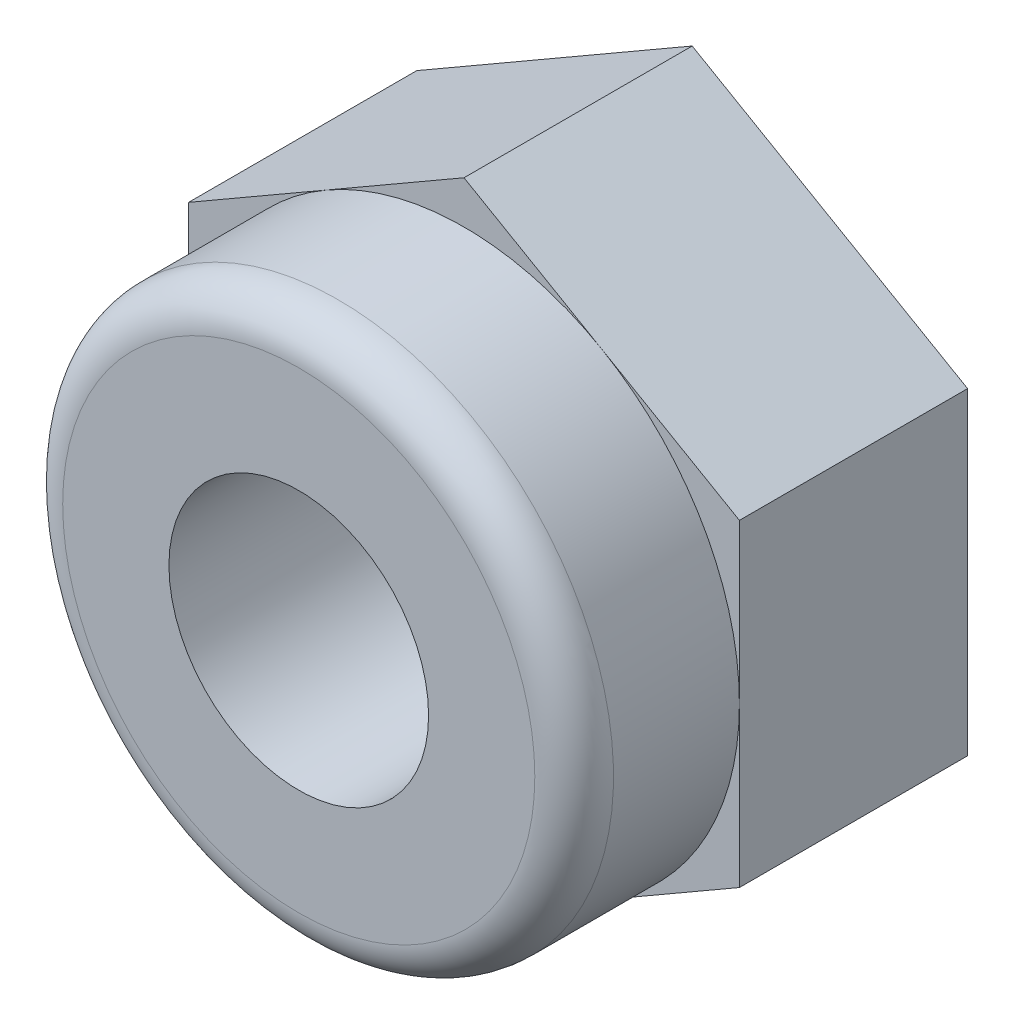
ISO-10303-21;
HEADER;
FILE_DESCRIPTION(('STEP AP214'),'2;1');
FILE_NAME('part.step','',(''),(''),'','','');
FILE_SCHEMA(('AUTOMOTIVE_DESIGN { 1 0 10303 214 1 1 1 1 }'));
ENDSEC;
DATA;
#1=APPLICATION_CONTEXT('core data for automotive mechanical design processes');
#2=APPLICATION_PROTOCOL_DEFINITION('international standard','automotive_design',2000,#1);
#3=PRODUCT_CONTEXT('',#1,'mechanical');
#4=PRODUCT('Part','Part','',(#3));
#5=PRODUCT_RELATED_PRODUCT_CATEGORY('part','',(#4));
#6=PRODUCT_DEFINITION_FORMATION('','',#4);
#7=PRODUCT_DEFINITION_CONTEXT('part definition',#1,'design');
#8=PRODUCT_DEFINITION('design','',#6,#7);
#9=PRODUCT_DEFINITION_SHAPE('','',#8);
#10=(LENGTH_UNIT() NAMED_UNIT(*) SI_UNIT(.MILLI.,.METRE.));
#11=(NAMED_UNIT(*) PLANE_ANGLE_UNIT() SI_UNIT($,.RADIAN.));
#12=(NAMED_UNIT(*) SI_UNIT($,.STERADIAN.) SOLID_ANGLE_UNIT());
#13=UNCERTAINTY_MEASURE_WITH_UNIT(LENGTH_MEASURE(1.E-05),#10,'distance_accuracy_value','');
#14=(GEOMETRIC_REPRESENTATION_CONTEXT(3) GLOBAL_UNCERTAINTY_ASSIGNED_CONTEXT((#13)) GLOBAL_UNIT_ASSIGNED_CONTEXT((#10,
#11,#12)) REPRESENTATION_CONTEXT('',''));
#15=CARTESIAN_POINT('',(0.,0.,0.));
#16=DIRECTION('',(0.,0.,1.));
#17=DIRECTION('',(1.,0.,0.));
#18=AXIS2_PLACEMENT_3D('',#15,#16,#17);
#19=CARTESIAN_POINT('',(0.,0.,4.5));
#20=DIRECTION('',(0.,0.,1.));
#21=DIRECTION('',(1.,0.,0.));
#22=AXIS2_PLACEMENT_3D('',#19,#20,#21);
#23=TOROIDAL_SURFACE('',#22,2.99999999999999,0.5);
#24=CARTESIAN_POINT('',(0.,0.,4.5));
#25=DIRECTION('',(0.,0.,-1.));
#26=DIRECTION('',(-1.,0.,0.));
#27=AXIS2_PLACEMENT_3D('',#24,#25,#26);
#28=CIRCLE('',#27,3.49999999999999);
#29=CARTESIAN_POINT('',(-3.49999999999999,0.,4.5));
#30=VERTEX_POINT('',#29);
#31=EDGE_CURVE('E186',#30,#30,#28,.T.);
#32=ORIENTED_EDGE('',*,*,#31,.F.);
#33=EDGE_LOOP('',(#32));
#34=FACE_BOUND('',#33,.T.);
#35=CARTESIAN_POINT('',(0.,0.,5.));
#36=DIRECTION('',(0.,0.,-1.));
#37=DIRECTION('',(1.,0.,0.));
#38=AXIS2_PLACEMENT_3D('',#35,#36,#37);
#39=CIRCLE('',#38,2.99999999999999);
#40=CARTESIAN_POINT('',(-2.99999999999999,0.,5.));
#41=VERTEX_POINT('',#40);
#42=CARTESIAN_POINT('',(2.99999999999999,0.,5.));
#43=VERTEX_POINT('',#42);
#44=EDGE_CURVE('E116',#41,#43,#39,.F.);
#45=ORIENTED_EDGE('',*,*,#44,.F.);
#46=CARTESIAN_POINT('',(0.,0.,5.));
#47=DIRECTION('',(0.,0.,-1.));
#48=DIRECTION('',(-1.,0.,0.));
#49=AXIS2_PLACEMENT_3D('',#46,#47,#48);
#50=CIRCLE('',#49,2.99999999999999);
#51=EDGE_CURVE('E154',#43,#41,#50,.F.);
#52=ORIENTED_EDGE('',*,*,#51,.F.);
#53=EDGE_LOOP('',(#45,#52));
#54=FACE_BOUND('',#53,.T.);
#55=ADVANCED_FACE('F17',(#34,#54),#23,.T.);
#56=CARTESIAN_POINT('',(0.,0.,5.));
#57=DIRECTION('',(0.,0.,-1.));
#58=DIRECTION('',(-1.,0.,0.));
#59=AXIS2_PLACEMENT_3D('',#56,#57,#58);
#60=CYLINDRICAL_SURFACE('',#59,3.49999999999999);
#61=CARTESIAN_POINT('',(0.,0.,2.9));
#62=DIRECTION('',(0.,0.,-1.));
#63=DIRECTION('',(-1.,0.,0.));
#64=AXIS2_PLACEMENT_3D('',#61,#62,#63);
#65=CIRCLE('',#64,3.49999999999999);
#66=CARTESIAN_POINT('',(3.49999999999999,0.,2.9));
#67=VERTEX_POINT('',#66);
#68=CARTESIAN_POINT('',(1.75000000000002,-3.03108891324551,2.9));
#69=VERTEX_POINT('',#68);
#70=EDGE_CURVE('E203',#67,#69,#65,.T.);
#71=ORIENTED_EDGE('',*,*,#70,.F.);
#72=CARTESIAN_POINT('',(0.,0.,2.9));
#73=DIRECTION('',(0.,0.,-1.));
#74=DIRECTION('',(-1.,0.,0.));
#75=AXIS2_PLACEMENT_3D('',#72,#73,#74);
#76=CIRCLE('',#75,3.49999999999999);
#77=CARTESIAN_POINT('',(1.74999999999998,3.03108891324554,2.9));
#78=VERTEX_POINT('',#77);
#79=EDGE_CURVE('E201',#78,#67,#76,.T.);
#80=ORIENTED_EDGE('',*,*,#79,.F.);
#81=CARTESIAN_POINT('',(0.,0.,2.9));
#82=DIRECTION('',(0.,0.,-1.));
#83=DIRECTION('',(-1.,0.,0.));
#84=AXIS2_PLACEMENT_3D('',#81,#82,#83);
#85=CIRCLE('',#84,3.49999999999999);
#86=CARTESIAN_POINT('',(-1.75,3.03108891324553,2.9));
#87=VERTEX_POINT('',#86);
#88=EDGE_CURVE('E112',#87,#78,#85,.T.);
#89=ORIENTED_EDGE('',*,*,#88,.F.);
#90=CARTESIAN_POINT('',(0.,0.,2.9));
#91=DIRECTION('',(0.,0.,-1.));
#92=DIRECTION('',(-1.,0.,0.));
#93=AXIS2_PLACEMENT_3D('',#90,#91,#92);
#94=CIRCLE('',#93,3.49999999999999);
#95=CARTESIAN_POINT('',(-3.49999999999999,0.,2.9));
#96=VERTEX_POINT('',#95);
#97=EDGE_CURVE('E104',#96,#87,#94,.T.);
#98=ORIENTED_EDGE('',*,*,#97,.F.);
#99=CARTESIAN_POINT('',(0.,0.,2.9));
#100=DIRECTION('',(0.,0.,-1.));
#101=DIRECTION('',(-1.,0.,0.));
#102=AXIS2_PLACEMENT_3D('',#99,#100,#101);
#103=CIRCLE('',#102,3.49999999999999);
#104=CARTESIAN_POINT('',(-1.74999999999998,-3.03108891324554,2.9));
#105=VERTEX_POINT('',#104);
#106=EDGE_CURVE('E93',#105,#96,#103,.T.);
#107=ORIENTED_EDGE('',*,*,#106,.F.);
#108=CARTESIAN_POINT('',(0.,0.,2.9));
#109=DIRECTION('',(0.,0.,-1.));
#110=DIRECTION('',(-1.,0.,0.));
#111=AXIS2_PLACEMENT_3D('',#108,#109,#110);
#112=CIRCLE('',#111,3.49999999999999);
#113=EDGE_CURVE('E103',#69,#105,#112,.T.);
#114=ORIENTED_EDGE('',*,*,#113,.F.);
#115=EDGE_LOOP('',(#71,#80,#89,#98,#107,#114));
#116=FACE_BOUND('',#115,.T.);
#117=ORIENTED_EDGE('',*,*,#31,.T.);
#118=EDGE_LOOP('',(#117));
#119=FACE_BOUND('',#118,.T.);
#120=ADVANCED_FACE('F109',(#116,#119),#60,.T.);
#121=CARTESIAN_POINT('',(0.,0.,5.));
#122=DIRECTION('',(0.,0.,1.));
#123=DIRECTION('',(1.,0.,0.));
#124=AXIS2_PLACEMENT_3D('',#121,#122,#123);
#125=PLANE('',#124);
#126=ORIENTED_EDGE('',*,*,#51,.T.);
#127=ORIENTED_EDGE('',*,*,#44,.T.);
#128=EDGE_LOOP('',(#126,#127));
#129=FACE_BOUND('',#128,.T.);
#130=CARTESIAN_POINT('',(0.,0.,5.));
#131=DIRECTION('',(0.,0.,1.));
#132=DIRECTION('',(1.,0.,0.));
#133=AXIS2_PLACEMENT_3D('',#130,#131,#132);
#134=CIRCLE('',#133,1.65);
#135=CARTESIAN_POINT('',(1.65,0.,5.));
#136=VERTEX_POINT('',#135);
#137=EDGE_CURVE('E197',#136,#136,#134,.F.);
#138=ORIENTED_EDGE('',*,*,#137,.T.);
#139=EDGE_LOOP('',(#138));
#140=FACE_BOUND('',#139,.T.);
#141=ADVANCED_FACE('F161',(#129,#140),#125,.T.);
#142=CARTESIAN_POINT('',(0.,0.,2.9));
#143=DIRECTION('',(0.,0.,1.));
#144=DIRECTION('',(1.,0.,0.));
#145=AXIS2_PLACEMENT_3D('',#142,#143,#144);
#146=PLANE('',#145);
#147=DIRECTION('',(0.866025403784438,0.500000000000001,0.));
#148=VECTOR('',#147,1.);
#149=CARTESIAN_POINT('',(0.,4.04145188432737,2.9));
#150=LINE('',#149,#148);
#151=CARTESIAN_POINT('',(-3.5,2.02072594216368,2.9));
#152=VERTEX_POINT('',#151);
#153=EDGE_CURVE('E128',#87,#152,#150,.F.);
#154=ORIENTED_EDGE('',*,*,#153,.T.);
#155=DIRECTION('',(0.,1.,0.));
#156=VECTOR('',#155,1.);
#157=CARTESIAN_POINT('',(-3.5,2.02072594216368,2.9));
#158=LINE('',#157,#156);
#159=EDGE_CURVE('E122',#152,#96,#158,.F.);
#160=ORIENTED_EDGE('',*,*,#159,.T.);
#161=ORIENTED_EDGE('',*,*,#97,.T.);
#162=EDGE_LOOP('',(#154,#160,#161));
#163=FACE_BOUND('',#162,.T.);
#164=ADVANCED_FACE('F127',(#163),#146,.T.);
#165=CARTESIAN_POINT('',(0.,0.,2.9));
#166=DIRECTION('',(0.,0.,1.));
#167=DIRECTION('',(1.,0.,0.));
#168=AXIS2_PLACEMENT_3D('',#165,#166,#167);
#169=PLANE('',#168);
#170=DIRECTION('',(0.,1.,0.));
#171=VECTOR('',#170,1.);
#172=CARTESIAN_POINT('',(-3.5,2.02072594216368,2.9));
#173=LINE('',#172,#171);
#174=CARTESIAN_POINT('',(-3.49999999999998,-2.0207259421637,2.9));
#175=VERTEX_POINT('',#174);
#176=EDGE_CURVE('E97',#96,#175,#173,.F.);
#177=ORIENTED_EDGE('',*,*,#176,.T.);
#178=DIRECTION('',(-0.866025403784442,0.499999999999995,0.));
#179=VECTOR('',#178,1.);
#180=CARTESIAN_POINT('',(-3.49999999999998,-2.0207259421637,2.9));
#181=LINE('',#180,#179);
#182=EDGE_CURVE('E99',#175,#105,#181,.F.);
#183=ORIENTED_EDGE('',*,*,#182,.T.);
#184=ORIENTED_EDGE('',*,*,#106,.T.);
#185=EDGE_LOOP('',(#177,#183,#184));
#186=FACE_BOUND('',#185,.T.);
#187=ADVANCED_FACE('F95',(#186),#169,.T.);
#188=CARTESIAN_POINT('',(0.,0.,2.9));
#189=DIRECTION('',(0.,0.,1.));
#190=DIRECTION('',(1.,0.,0.));
#191=AXIS2_PLACEMENT_3D('',#188,#189,#190);
#192=PLANE('',#191);
#193=DIRECTION('',(-0.866025403784442,0.499999999999995,0.));
#194=VECTOR('',#193,1.);
#195=CARTESIAN_POINT('',(-3.49999999999998,-2.0207259421637,2.9));
#196=LINE('',#195,#194);
#197=CARTESIAN_POINT('',(0.,-4.04145188432737,2.9));
#198=VERTEX_POINT('',#197);
#199=EDGE_CURVE('E377',#105,#198,#196,.F.);
#200=ORIENTED_EDGE('',*,*,#199,.T.);
#201=DIRECTION('',(-0.866025403784435,-0.500000000000007,0.));
#202=VECTOR('',#201,1.);
#203=CARTESIAN_POINT('',(0.,-4.04145188432737,2.9));
#204=LINE('',#203,#202);
#205=EDGE_CURVE('E379',#198,#69,#204,.F.);
#206=ORIENTED_EDGE('',*,*,#205,.T.);
#207=ORIENTED_EDGE('',*,*,#113,.T.);
#208=EDGE_LOOP('',(#200,#206,#207));
#209=FACE_BOUND('',#208,.T.);
#210=ADVANCED_FACE('F322',(#209),#192,.T.);
#211=CARTESIAN_POINT('',(0.,0.,2.9));
#212=DIRECTION('',(0.,0.,1.));
#213=DIRECTION('',(1.,0.,0.));
#214=AXIS2_PLACEMENT_3D('',#211,#212,#213);
#215=PLANE('',#214);
#216=DIRECTION('',(-0.866025403784435,-0.500000000000007,0.));
#217=VECTOR('',#216,1.);
#218=CARTESIAN_POINT('',(0.,-4.04145188432737,2.9));
#219=LINE('',#218,#217);
#220=CARTESIAN_POINT('',(3.50000000000001,-2.02072594216365,2.9));
#221=VERTEX_POINT('',#220);
#222=EDGE_CURVE('E387',#69,#221,#219,.F.);
#223=ORIENTED_EDGE('',*,*,#222,.T.);
#224=DIRECTION('',(0.,-1.,0.));
#225=VECTOR('',#224,1.);
#226=CARTESIAN_POINT('',(3.50000000000001,-2.02072594216365,2.9));
#227=LINE('',#226,#225);
#228=EDGE_CURVE('E431',#221,#67,#227,.F.);
#229=ORIENTED_EDGE('',*,*,#228,.T.);
#230=ORIENTED_EDGE('',*,*,#70,.T.);
#231=EDGE_LOOP('',(#223,#229,#230));
#232=FACE_BOUND('',#231,.T.);
#233=ADVANCED_FACE('F313',(#232),#215,.T.);
#234=CARTESIAN_POINT('',(0.,0.,2.9));
#235=DIRECTION('',(0.,0.,1.));
#236=DIRECTION('',(1.,0.,0.));
#237=AXIS2_PLACEMENT_3D('',#234,#235,#236);
#238=PLANE('',#237);
#239=DIRECTION('',(0.,-1.,0.));
#240=VECTOR('',#239,1.);
#241=CARTESIAN_POINT('',(3.50000000000001,-2.02072594216365,2.9));
#242=LINE('',#241,#240);
#243=CARTESIAN_POINT('',(3.49999999999997,2.02072594216373,2.9));
#244=VERTEX_POINT('',#243);
#245=EDGE_CURVE('E434',#67,#244,#242,.F.);
#246=ORIENTED_EDGE('',*,*,#245,.T.);
#247=DIRECTION('',(0.866025403784442,-0.499999999999995,0.));
#248=VECTOR('',#247,1.);
#249=CARTESIAN_POINT('',(3.49999999999997,2.02072594216373,2.9));
#250=LINE('',#249,#248);
#251=EDGE_CURVE('E446',#244,#78,#250,.F.);
#252=ORIENTED_EDGE('',*,*,#251,.T.);
#253=ORIENTED_EDGE('',*,*,#79,.T.);
#254=EDGE_LOOP('',(#246,#252,#253));
#255=FACE_BOUND('',#254,.T.);
#256=ADVANCED_FACE('F221',(#255),#238,.T.);
#257=CARTESIAN_POINT('',(0.,0.,2.9));
#258=DIRECTION('',(0.,0.,1.));
#259=DIRECTION('',(1.,0.,0.));
#260=AXIS2_PLACEMENT_3D('',#257,#258,#259);
#261=PLANE('',#260);
#262=DIRECTION('',(0.866025403784442,-0.499999999999995,0.));
#263=VECTOR('',#262,1.);
#264=CARTESIAN_POINT('',(3.49999999999997,2.02072594216373,2.9));
#265=LINE('',#264,#263);
#266=CARTESIAN_POINT('',(0.,4.04145188432737,2.9));
#267=VERTEX_POINT('',#266);
#268=EDGE_CURVE('E418',#78,#267,#265,.F.);
#269=ORIENTED_EDGE('',*,*,#268,.T.);
#270=DIRECTION('',(0.866025403784438,0.500000000000001,0.));
#271=VECTOR('',#270,1.);
#272=CARTESIAN_POINT('',(0.,4.04145188432737,2.9));
#273=LINE('',#272,#271);
#274=EDGE_CURVE('E141',#267,#87,#273,.F.);
#275=ORIENTED_EDGE('',*,*,#274,.T.);
#276=ORIENTED_EDGE('',*,*,#88,.T.);
#277=EDGE_LOOP('',(#269,#275,#276));
#278=FACE_BOUND('',#277,.T.);
#279=ADVANCED_FACE('F211',(#278),#261,.T.);
#280=CARTESIAN_POINT('',(0.,0.,5.));
#281=DIRECTION('',(0.,0.,1.));
#282=DIRECTION('',(1.,0.,0.));
#283=AXIS2_PLACEMENT_3D('',#280,#281,#282);
#284=CYLINDRICAL_SURFACE('',#283,1.65);
#285=CARTESIAN_POINT('',(0.,0.,0.));
#286=DIRECTION('',(0.,0.,1.));
#287=DIRECTION('',(1.,0.,0.));
#288=AXIS2_PLACEMENT_3D('',#285,#286,#287);
#289=CIRCLE('',#288,1.65);
#290=CARTESIAN_POINT('',(1.65,0.,0.));
#291=VERTEX_POINT('',#290);
#292=EDGE_CURVE('E148',#291,#291,#289,.F.);
#293=ORIENTED_EDGE('',*,*,#292,.T.);
#294=EDGE_LOOP('',(#293));
#295=FACE_BOUND('',#294,.T.);
#296=ORIENTED_EDGE('',*,*,#137,.F.);
#297=EDGE_LOOP('',(#296));
#298=FACE_BOUND('',#297,.T.);
#299=ADVANCED_FACE('F208',(#295,#298),#284,.F.);
#300=CARTESIAN_POINT('',(0.,4.04145188432737,2.9));
#301=DIRECTION('',(0.500000000000001,-0.866025403784438,0.));
#302=DIRECTION('',(0.866025403784438,0.500000000000001,0.));
#303=AXIS2_PLACEMENT_3D('',#300,#301,#302);
#304=PLANE('',#303);
#305=DIRECTION('',(0.,0.,1.));
#306=VECTOR('',#305,1.);
#307=CARTESIAN_POINT('',(-3.5,2.02072594216368,2.9));
#308=LINE('',#307,#306);
#309=CARTESIAN_POINT('',(-3.5,2.02072594216368,0.));
#310=VERTEX_POINT('',#309);
#311=EDGE_CURVE('E129',#310,#152,#308,.T.);
#312=ORIENTED_EDGE('',*,*,#311,.T.);
#313=ORIENTED_EDGE('',*,*,#153,.F.);
#314=ORIENTED_EDGE('',*,*,#274,.F.);
#315=DIRECTION('',(0.,0.,1.));
#316=VECTOR('',#315,1.);
#317=CARTESIAN_POINT('',(0.,4.04145188432737,2.9));
#318=LINE('',#317,#316);
#319=CARTESIAN_POINT('',(0.,4.04145188432737,0.));
#320=VERTEX_POINT('',#319);
#321=EDGE_CURVE('E196',#267,#320,#318,.F.);
#322=ORIENTED_EDGE('',*,*,#321,.T.);
#323=DIRECTION('',(-0.866025403784438,-0.500000000000001,0.));
#324=VECTOR('',#323,1.);
#325=CARTESIAN_POINT('',(0.,4.04145188432737,0.));
#326=LINE('',#325,#324);
#327=EDGE_CURVE('E144',#320,#310,#326,.T.);
#328=ORIENTED_EDGE('',*,*,#327,.T.);
#329=EDGE_LOOP('',(#312,#313,#314,#322,#328));
#330=FACE_BOUND('',#329,.T.);
#331=ADVANCED_FACE('F210',(#330),#304,.F.);
#332=CARTESIAN_POINT('',(-3.5,2.02072594216368,2.9));
#333=DIRECTION('',(1.,0.,0.));
#334=DIRECTION('',(0.,1.,0.));
#335=AXIS2_PLACEMENT_3D('',#332,#333,#334);
#336=PLANE('',#335);
#337=DIRECTION('',(0.,0.,1.));
#338=VECTOR('',#337,1.);
#339=CARTESIAN_POINT('',(-3.49999999999998,-2.0207259421637,2.9));
#340=LINE('',#339,#338);
#341=CARTESIAN_POINT('',(-3.49999999999999,-2.0207259421637,0.));
#342=VERTEX_POINT('',#341);
#343=EDGE_CURVE('E125',#342,#175,#340,.T.);
#344=ORIENTED_EDGE('',*,*,#343,.T.);
#345=ORIENTED_EDGE('',*,*,#176,.F.);
#346=ORIENTED_EDGE('',*,*,#159,.F.);
#347=ORIENTED_EDGE('',*,*,#311,.F.);
#348=DIRECTION('',(0.,1.,0.));
#349=VECTOR('',#348,1.);
#350=CARTESIAN_POINT('',(-3.5,0.,0.));
#351=LINE('',#350,#349);
#352=EDGE_CURVE('E147',#310,#342,#351,.F.);
#353=ORIENTED_EDGE('',*,*,#352,.T.);
#354=EDGE_LOOP('',(#344,#345,#346,#347,#353));
#355=FACE_BOUND('',#354,.T.);
#356=ADVANCED_FACE('F121',(#355),#336,.F.);
#357=CARTESIAN_POINT('',(-3.49999999999998,-2.0207259421637,2.9));
#358=DIRECTION('',(0.499999999999995,0.866025403784442,0.));
#359=DIRECTION('',(-0.866025403784442,0.499999999999995,0.));
#360=AXIS2_PLACEMENT_3D('',#357,#358,#359);
#361=PLANE('',#360);
#362=DIRECTION('',(0.,0.,1.));
#363=VECTOR('',#362,1.);
#364=CARTESIAN_POINT('',(0.,-4.04145188432737,2.9));
#365=LINE('',#364,#363);
#366=CARTESIAN_POINT('',(0.,-4.04145188432737,0.));
#367=VERTEX_POINT('',#366);
#368=EDGE_CURVE('E381',#367,#198,#365,.T.);
#369=ORIENTED_EDGE('',*,*,#368,.T.);
#370=ORIENTED_EDGE('',*,*,#199,.F.);
#371=ORIENTED_EDGE('',*,*,#182,.F.);
#372=ORIENTED_EDGE('',*,*,#343,.F.);
#373=DIRECTION('',(0.866025403784442,-0.499999999999995,0.));
#374=VECTOR('',#373,1.);
#375=CARTESIAN_POINT('',(-3.49999999999998,-2.0207259421637,0.));
#376=LINE('',#375,#374);
#377=EDGE_CURVE('E391',#342,#367,#376,.T.);
#378=ORIENTED_EDGE('',*,*,#377,.T.);
#379=EDGE_LOOP('',(#369,#370,#371,#372,#378));
#380=FACE_BOUND('',#379,.T.);
#381=ADVANCED_FACE('F243',(#380),#361,.F.);
#382=CARTESIAN_POINT('',(0.,-4.04145188432737,2.9));
#383=DIRECTION('',(-0.500000000000007,0.866025403784435,0.));
#384=DIRECTION('',(-0.866025403784435,-0.500000000000007,0.));
#385=AXIS2_PLACEMENT_3D('',#382,#383,#384);
#386=PLANE('',#385);
#387=DIRECTION('',(0.,0.,1.));
#388=VECTOR('',#387,1.);
#389=CARTESIAN_POINT('',(3.50000000000001,-2.02072594216365,2.9));
#390=LINE('',#389,#388);
#391=CARTESIAN_POINT('',(3.50000000000001,-2.02072594216365,0.));
#392=VERTEX_POINT('',#391);
#393=EDGE_CURVE('E423',#392,#221,#390,.T.);
#394=ORIENTED_EDGE('',*,*,#393,.T.);
#395=ORIENTED_EDGE('',*,*,#222,.F.);
#396=ORIENTED_EDGE('',*,*,#205,.F.);
#397=ORIENTED_EDGE('',*,*,#368,.F.);
#398=DIRECTION('',(0.866025403784435,0.500000000000007,0.));
#399=VECTOR('',#398,1.);
#400=CARTESIAN_POINT('',(0.,-4.04145188432737,0.));
#401=LINE('',#400,#399);
#402=EDGE_CURVE('E401',#367,#392,#401,.T.);
#403=ORIENTED_EDGE('',*,*,#402,.T.);
#404=EDGE_LOOP('',(#394,#395,#396,#397,#403));
#405=FACE_BOUND('',#404,.T.);
#406=ADVANCED_FACE('F239',(#405),#386,.F.);
#407=CARTESIAN_POINT('',(3.50000000000001,-2.02072594216365,2.9));
#408=DIRECTION('',(-1.,0.,0.));
#409=DIRECTION('',(0.,-1.,0.));
#410=AXIS2_PLACEMENT_3D('',#407,#408,#409);
#411=PLANE('',#410);
#412=DIRECTION('',(0.,0.,1.));
#413=VECTOR('',#412,1.);
#414=CARTESIAN_POINT('',(3.49999999999997,2.02072594216373,2.9));
#415=LINE('',#414,#413);
#416=CARTESIAN_POINT('',(3.49999999999997,2.02072594216373,0.));
#417=VERTEX_POINT('',#416);
#418=EDGE_CURVE('E37',#417,#244,#415,.T.);
#419=ORIENTED_EDGE('',*,*,#418,.T.);
#420=ORIENTED_EDGE('',*,*,#245,.F.);
#421=ORIENTED_EDGE('',*,*,#228,.F.);
#422=ORIENTED_EDGE('',*,*,#393,.F.);
#423=DIRECTION('',(0.,1.,0.));
#424=VECTOR('',#423,1.);
#425=CARTESIAN_POINT('',(3.50000000000001,0.,0.));
#426=LINE('',#425,#424);
#427=EDGE_CURVE('E29',#392,#417,#426,.T.);
#428=ORIENTED_EDGE('',*,*,#427,.T.);
#429=EDGE_LOOP('',(#419,#420,#421,#422,#428));
#430=FACE_BOUND('',#429,.T.);
#431=ADVANCED_FACE('F232',(#430),#411,.F.);
#432=CARTESIAN_POINT('',(3.49999999999997,2.02072594216373,2.9));
#433=DIRECTION('',(-0.499999999999995,-0.866025403784442,0.));
#434=DIRECTION('',(0.866025403784442,-0.499999999999995,0.));
#435=AXIS2_PLACEMENT_3D('',#432,#433,#434);
#436=PLANE('',#435);
#437=ORIENTED_EDGE('',*,*,#321,.F.);
#438=ORIENTED_EDGE('',*,*,#268,.F.);
#439=ORIENTED_EDGE('',*,*,#251,.F.);
#440=ORIENTED_EDGE('',*,*,#418,.F.);
#441=DIRECTION('',(-0.866025403784442,0.499999999999995,0.));
#442=VECTOR('',#441,1.);
#443=CARTESIAN_POINT('',(3.49999999999997,2.02072594216373,0.));
#444=LINE('',#443,#442);
#445=EDGE_CURVE('E10',#417,#320,#444,.T.);
#446=ORIENTED_EDGE('',*,*,#445,.T.);
#447=EDGE_LOOP('',(#437,#438,#439,#440,#446));
#448=FACE_BOUND('',#447,.T.);
#449=ADVANCED_FACE('F226',(#448),#436,.F.);
#450=CARTESIAN_POINT('',(0.,0.,0.));
#451=DIRECTION('',(0.,0.,1.));
#452=DIRECTION('',(1.,0.,0.));
#453=AXIS2_PLACEMENT_3D('',#450,#451,#452);
#454=PLANE('',#453);
#455=ORIENTED_EDGE('',*,*,#427,.F.);
#456=ORIENTED_EDGE('',*,*,#402,.F.);
#457=ORIENTED_EDGE('',*,*,#377,.F.);
#458=ORIENTED_EDGE('',*,*,#352,.F.);
#459=ORIENTED_EDGE('',*,*,#327,.F.);
#460=ORIENTED_EDGE('',*,*,#445,.F.);
#461=EDGE_LOOP('',(#455,#456,#457,#458,#459,#460));
#462=FACE_BOUND('',#461,.T.);
#463=ORIENTED_EDGE('',*,*,#292,.F.);
#464=EDGE_LOOP('',(#463));
#465=FACE_BOUND('',#464,.T.);
#466=ADVANCED_FACE('F224',(#462,#465),#454,.F.);
#467=CLOSED_SHELL('',(#55,#120,#141,#164,#187,#210,#233,#256,#279,#299,#331,#356,#381,#406,#431,
#449,#466));
#468=MANIFOLD_SOLID_BREP('B1',#467);
#469=ADVANCED_BREP_SHAPE_REPRESENTATION('',(#18,#468),#14);
#470=SHAPE_DEFINITION_REPRESENTATION(#9,#469);
ENDSEC;
END-ISO-10303-21;
